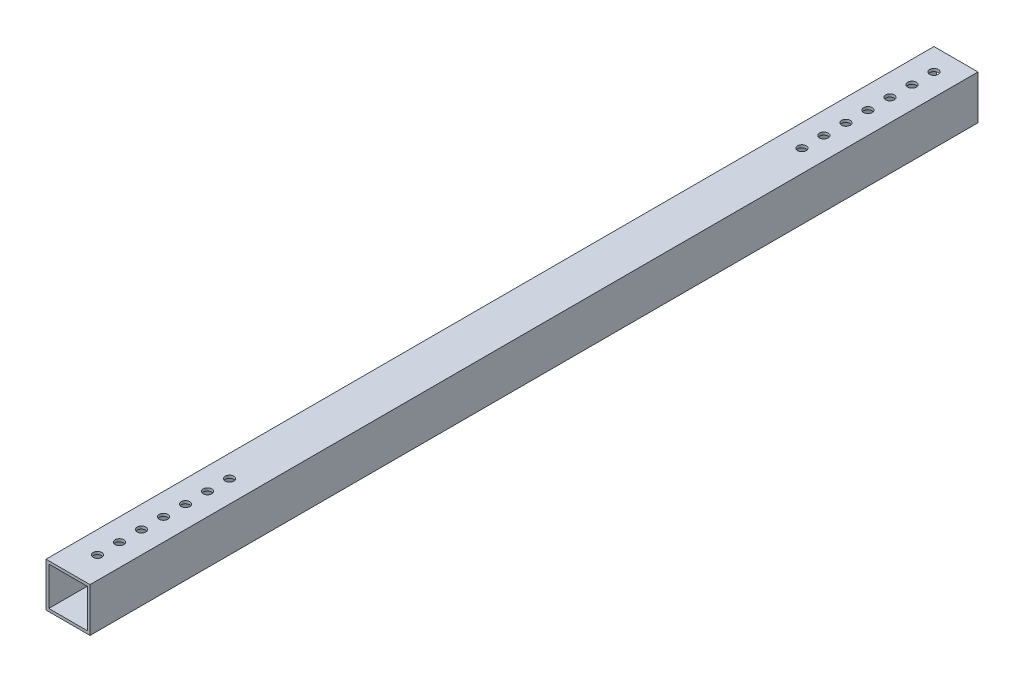
ISO-10303-21;
HEADER;
FILE_DESCRIPTION(('STEP AP214'),'2;1');
FILE_NAME('part.step','',(''),(''),'','','');
FILE_SCHEMA(('AUTOMOTIVE_DESIGN { 1 0 10303 214 1 1 1 1 }'));
ENDSEC;
DATA;
#1=APPLICATION_CONTEXT('core data for automotive mechanical design processes');
#2=APPLICATION_PROTOCOL_DEFINITION('international standard','automotive_design',2000,#1);
#3=PRODUCT_CONTEXT('',#1,'mechanical');
#4=PRODUCT('Part','Part','',(#3));
#5=PRODUCT_RELATED_PRODUCT_CATEGORY('part','',(#4));
#6=PRODUCT_DEFINITION_FORMATION('','',#4);
#7=PRODUCT_DEFINITION_CONTEXT('part definition',#1,'design');
#8=PRODUCT_DEFINITION('design','',#6,#7);
#9=PRODUCT_DEFINITION_SHAPE('','',#8);
#10=(LENGTH_UNIT() NAMED_UNIT(*) SI_UNIT(.MILLI.,.METRE.));
#11=(NAMED_UNIT(*) PLANE_ANGLE_UNIT() SI_UNIT($,.RADIAN.));
#12=(NAMED_UNIT(*) SI_UNIT($,.STERADIAN.) SOLID_ANGLE_UNIT());
#13=UNCERTAINTY_MEASURE_WITH_UNIT(LENGTH_MEASURE(1.E-05),#10,'distance_accuracy_value','');
#14=(GEOMETRIC_REPRESENTATION_CONTEXT(3) GLOBAL_UNCERTAINTY_ASSIGNED_CONTEXT((#13)) GLOBAL_UNIT_ASSIGNED_CONTEXT((#10,
#11,#12)) REPRESENTATION_CONTEXT('',''));
#15=CARTESIAN_POINT('',(0.,0.,0.));
#16=DIRECTION('',(0.,0.,1.));
#17=DIRECTION('',(1.,0.,0.));
#18=AXIS2_PLACEMENT_3D('',#15,#16,#17);
#19=CARTESIAN_POINT('',(0.,0.,256.145698528));
#20=DIRECTION('',(0.,0.,-1.));
#21=DIRECTION('',(-1.,0.,0.));
#22=AXIS2_PLACEMENT_3D('',#19,#20,#21);
#23=PLANE('',#22);
#24=DIRECTION('',(0.,1.,0.));
#25=VECTOR('',#24,1.);
#26=CARTESIAN_POINT('',(12.7,-12.7,256.145698528));
#27=LINE('',#26,#25);
#28=CARTESIAN_POINT('',(12.7,-12.7,256.145698528));
#29=VERTEX_POINT('',#28);
#30=CARTESIAN_POINT('',(12.7,12.7,256.145698528));
#31=VERTEX_POINT('',#30);
#32=EDGE_CURVE('E155',#29,#31,#27,.T.);
#33=ORIENTED_EDGE('',*,*,#32,.T.);
#34=DIRECTION('',(-1.,0.,0.));
#35=VECTOR('',#34,1.);
#36=CARTESIAN_POINT('',(-12.7,12.7,256.145698528));
#37=LINE('',#36,#35);
#38=CARTESIAN_POINT('',(-12.7,12.7,256.145698528));
#39=VERTEX_POINT('',#38);
#40=EDGE_CURVE('E159',#31,#39,#37,.T.);
#41=ORIENTED_EDGE('',*,*,#40,.T.);
#42=DIRECTION('',(0.,-1.,0.));
#43=VECTOR('',#42,1.);
#44=CARTESIAN_POINT('',(-12.7,-12.7,256.145698528));
#45=LINE('',#44,#43);
#46=CARTESIAN_POINT('',(-12.7,-12.7,256.145698528));
#47=VERTEX_POINT('',#46);
#48=EDGE_CURVE('E163',#39,#47,#45,.T.);
#49=ORIENTED_EDGE('',*,*,#48,.T.);
#50=DIRECTION('',(1.,0.,0.));
#51=VECTOR('',#50,1.);
#52=CARTESIAN_POINT('',(-12.7,-12.7,256.145698528));
#53=LINE('',#52,#51);
#54=EDGE_CURVE('E166',#47,#29,#53,.T.);
#55=ORIENTED_EDGE('',*,*,#54,.T.);
#56=EDGE_LOOP('',(#33,#41,#49,#55));
#57=FACE_BOUND('',#56,.T.);
#58=DIRECTION('',(0.,1.,0.));
#59=VECTOR('',#58,1.);
#60=CARTESIAN_POINT('',(11.1125,0.,256.145698528));
#61=LINE('',#60,#59);
#62=CARTESIAN_POINT('',(11.1125,-11.1125,256.145698528));
#63=VERTEX_POINT('',#62);
#64=CARTESIAN_POINT('',(11.1125,11.1125,256.145698528));
#65=VERTEX_POINT('',#64);
#66=EDGE_CURVE('E137',#63,#65,#61,.T.);
#67=ORIENTED_EDGE('',*,*,#66,.F.);
#68=DIRECTION('',(1.,0.,0.));
#69=VECTOR('',#68,1.);
#70=CARTESIAN_POINT('',(0.,-11.1125,256.145698528));
#71=LINE('',#70,#69);
#72=CARTESIAN_POINT('',(-11.1125,-11.1125,256.145698528));
#73=VERTEX_POINT('',#72);
#74=EDGE_CURVE('E118',#73,#63,#71,.T.);
#75=ORIENTED_EDGE('',*,*,#74,.F.);
#76=DIRECTION('',(0.,-1.,0.));
#77=VECTOR('',#76,1.);
#78=CARTESIAN_POINT('',(-11.1125,0.,256.145698528));
#79=LINE('',#78,#77);
#80=CARTESIAN_POINT('',(-11.1125,11.1125,256.145698528));
#81=VERTEX_POINT('',#80);
#82=EDGE_CURVE('E150',#81,#73,#79,.T.);
#83=ORIENTED_EDGE('',*,*,#82,.F.);
#84=DIRECTION('',(-1.,0.,0.));
#85=VECTOR('',#84,1.);
#86=CARTESIAN_POINT('',(0.,11.1125,256.145698528));
#87=LINE('',#86,#85);
#88=EDGE_CURVE('E141',#65,#81,#87,.T.);
#89=ORIENTED_EDGE('',*,*,#88,.F.);
#90=EDGE_LOOP('',(#67,#75,#83,#89));
#91=FACE_BOUND('',#90,.T.);
#92=ADVANCED_FACE('F45',(#57,#91),#23,.F.);
#93=CARTESIAN_POINT('',(0.,0.,-256.145698528));
#94=DIRECTION('',(0.,0.,-1.));
#95=DIRECTION('',(-1.,0.,0.));
#96=AXIS2_PLACEMENT_3D('',#93,#94,#95);
#97=PLANE('',#96);
#98=DIRECTION('',(0.,1.,0.));
#99=VECTOR('',#98,1.);
#100=CARTESIAN_POINT('',(12.7,-12.7,-256.145698528));
#101=LINE('',#100,#99);
#102=CARTESIAN_POINT('',(12.7,-12.7,-256.145698528));
#103=VERTEX_POINT('',#102);
#104=CARTESIAN_POINT('',(12.7,12.7,-256.145698528));
#105=VERTEX_POINT('',#104);
#106=EDGE_CURVE('E170',#103,#105,#101,.T.);
#107=ORIENTED_EDGE('',*,*,#106,.F.);
#108=DIRECTION('',(1.,0.,0.));
#109=VECTOR('',#108,1.);
#110=CARTESIAN_POINT('',(-12.7,-12.7,-256.145698528));
#111=LINE('',#110,#109);
#112=CARTESIAN_POINT('',(-12.7,-12.7,-256.145698528));
#113=VERTEX_POINT('',#112);
#114=EDGE_CURVE('E160',#113,#103,#111,.T.);
#115=ORIENTED_EDGE('',*,*,#114,.F.);
#116=DIRECTION('',(0.,-1.,0.));
#117=VECTOR('',#116,1.);
#118=CARTESIAN_POINT('',(-12.7,-12.7,-256.145698528));
#119=LINE('',#118,#117);
#120=CARTESIAN_POINT('',(-12.7,12.7,-256.145698528));
#121=VERTEX_POINT('',#120);
#122=EDGE_CURVE('E177',#121,#113,#119,.T.);
#123=ORIENTED_EDGE('',*,*,#122,.F.);
#124=DIRECTION('',(-1.,0.,0.));
#125=VECTOR('',#124,1.);
#126=CARTESIAN_POINT('',(-12.7,12.7,-256.145698528));
#127=LINE('',#126,#125);
#128=EDGE_CURVE('E174',#105,#121,#127,.T.);
#129=ORIENTED_EDGE('',*,*,#128,.F.);
#130=EDGE_LOOP('',(#107,#115,#123,#129));
#131=FACE_BOUND('',#130,.T.);
#132=DIRECTION('',(1.,0.,0.));
#133=VECTOR('',#132,1.);
#134=CARTESIAN_POINT('',(0.,-11.1125,-256.145698528));
#135=LINE('',#134,#133);
#136=CARTESIAN_POINT('',(-11.1125,-11.1125,-256.145698528));
#137=VERTEX_POINT('',#136);
#138=CARTESIAN_POINT('',(11.1125,-11.1125,-256.145698528));
#139=VERTEX_POINT('',#138);
#140=EDGE_CURVE('E116',#137,#139,#135,.T.);
#141=ORIENTED_EDGE('',*,*,#140,.T.);
#142=DIRECTION('',(0.,1.,0.));
#143=VECTOR('',#142,1.);
#144=CARTESIAN_POINT('',(11.1125,0.,-256.145698528));
#145=LINE('',#144,#143);
#146=CARTESIAN_POINT('',(11.1125,11.1125,-256.145698528));
#147=VERTEX_POINT('',#146);
#148=EDGE_CURVE('E125',#139,#147,#145,.T.);
#149=ORIENTED_EDGE('',*,*,#148,.T.);
#150=DIRECTION('',(-1.,0.,0.));
#151=VECTOR('',#150,1.);
#152=CARTESIAN_POINT('',(0.,11.1125,-256.145698528));
#153=LINE('',#152,#151);
#154=CARTESIAN_POINT('',(-11.1125,11.1125,-256.145698528));
#155=VERTEX_POINT('',#154);
#156=EDGE_CURVE('E132',#147,#155,#153,.T.);
#157=ORIENTED_EDGE('',*,*,#156,.T.);
#158=DIRECTION('',(0.,-1.,0.));
#159=VECTOR('',#158,1.);
#160=CARTESIAN_POINT('',(-11.1125,0.,-256.145698528));
#161=LINE('',#160,#159);
#162=EDGE_CURVE('E70',#155,#137,#161,.T.);
#163=ORIENTED_EDGE('',*,*,#162,.T.);
#164=EDGE_LOOP('',(#141,#149,#157,#163));
#165=FACE_BOUND('',#164,.T.);
#166=ADVANCED_FACE('F135',(#131,#165),#97,.T.);
#167=CARTESIAN_POINT('',(12.7,-12.7,256.145698528));
#168=DIRECTION('',(-1.,0.,0.));
#169=DIRECTION('',(0.,0.,1.));
#170=AXIS2_PLACEMENT_3D('',#167,#168,#169);
#171=PLANE('',#170);
#172=ORIENTED_EDGE('',*,*,#106,.T.);
#173=DIRECTION('',(0.,0.,-1.));
#174=VECTOR('',#173,1.);
#175=CARTESIAN_POINT('',(12.7,12.7,256.145698528));
#176=LINE('',#175,#174);
#177=EDGE_CURVE('E11',#31,#105,#176,.T.);
#178=ORIENTED_EDGE('',*,*,#177,.F.);
#179=ORIENTED_EDGE('',*,*,#32,.F.);
#180=DIRECTION('',(0.,0.,-1.));
#181=VECTOR('',#180,1.);
#182=CARTESIAN_POINT('',(12.7,-12.7,256.145698528));
#183=LINE('',#182,#181);
#184=EDGE_CURVE('E169',#29,#103,#183,.T.);
#185=ORIENTED_EDGE('',*,*,#184,.T.);
#186=EDGE_LOOP('',(#172,#178,#179,#185));
#187=FACE_BOUND('',#186,.T.);
#188=ADVANCED_FACE('F47',(#187),#171,.F.);
#189=CARTESIAN_POINT('',(-12.7,12.7,256.145698528));
#190=DIRECTION('',(0.,-1.,0.));
#191=DIRECTION('',(0.,0.,-1.));
#192=AXIS2_PLACEMENT_3D('',#189,#190,#191);
#193=PLANE('',#192);
#194=CARTESIAN_POINT('',(0.,12.7,-243.445698528));
#195=DIRECTION('',(0.,1.,0.));
#196=DIRECTION('',(0.,0.,1.));
#197=AXIS2_PLACEMENT_3D('',#194,#195,#196);
#198=CIRCLE('',#197,2.48920000000001);
#199=CARTESIAN_POINT('',(0.,12.7,-240.956498528));
#200=VERTEX_POINT('',#199);
#201=EDGE_CURVE('E322',#200,#200,#198,.T.);
#202=ORIENTED_EDGE('',*,*,#201,.F.);
#203=EDGE_LOOP('',(#202));
#204=FACE_BOUND('',#203,.T.);
#205=CARTESIAN_POINT('',(0.,12.7,-230.745698528));
#206=DIRECTION('',(0.,1.,0.));
#207=DIRECTION('',(0.,0.,1.));
#208=AXIS2_PLACEMENT_3D('',#205,#206,#207);
#209=CIRCLE('',#208,2.48920000000001);
#210=CARTESIAN_POINT('',(0.,12.7,-228.256498528));
#211=VERTEX_POINT('',#210);
#212=EDGE_CURVE('E326',#211,#211,#209,.T.);
#213=ORIENTED_EDGE('',*,*,#212,.F.);
#214=EDGE_LOOP('',(#213));
#215=FACE_BOUND('',#214,.T.);
#216=CARTESIAN_POINT('',(0.,12.7,-218.045698528));
#217=DIRECTION('',(0.,1.,0.));
#218=DIRECTION('',(0.,0.,1.));
#219=AXIS2_PLACEMENT_3D('',#216,#217,#218);
#220=CIRCLE('',#219,2.48920000000001);
#221=CARTESIAN_POINT('',(0.,12.7,-215.556498528));
#222=VERTEX_POINT('',#221);
#223=EDGE_CURVE('E330',#222,#222,#220,.T.);
#224=ORIENTED_EDGE('',*,*,#223,.F.);
#225=EDGE_LOOP('',(#224));
#226=FACE_BOUND('',#225,.T.);
#227=CARTESIAN_POINT('',(0.,12.7,-205.345698528));
#228=DIRECTION('',(0.,1.,0.));
#229=DIRECTION('',(0.,0.,1.));
#230=AXIS2_PLACEMENT_3D('',#227,#228,#229);
#231=CIRCLE('',#230,2.48920000000001);
#232=CARTESIAN_POINT('',(0.,12.7,-202.856498528));
#233=VERTEX_POINT('',#232);
#234=EDGE_CURVE('E334',#233,#233,#231,.T.);
#235=ORIENTED_EDGE('',*,*,#234,.F.);
#236=EDGE_LOOP('',(#235));
#237=FACE_BOUND('',#236,.T.);
#238=CARTESIAN_POINT('',(0.,12.7,-192.645698528));
#239=DIRECTION('',(0.,1.,0.));
#240=DIRECTION('',(0.,0.,1.));
#241=AXIS2_PLACEMENT_3D('',#238,#239,#240);
#242=CIRCLE('',#241,2.48920000000001);
#243=CARTESIAN_POINT('',(0.,12.7,-190.156498528));
#244=VERTEX_POINT('',#243);
#245=EDGE_CURVE('E338',#244,#244,#242,.T.);
#246=ORIENTED_EDGE('',*,*,#245,.F.);
#247=EDGE_LOOP('',(#246));
#248=FACE_BOUND('',#247,.T.);
#249=CARTESIAN_POINT('',(0.,12.7,-179.945698528));
#250=DIRECTION('',(0.,1.,0.));
#251=DIRECTION('',(0.,0.,1.));
#252=AXIS2_PLACEMENT_3D('',#249,#250,#251);
#253=CIRCLE('',#252,2.48920000000001);
#254=CARTESIAN_POINT('',(0.,12.7,-177.456498528));
#255=VERTEX_POINT('',#254);
#256=EDGE_CURVE('E342',#255,#255,#253,.T.);
#257=ORIENTED_EDGE('',*,*,#256,.F.);
#258=EDGE_LOOP('',(#257));
#259=FACE_BOUND('',#258,.T.);
#260=CARTESIAN_POINT('',(0.,12.7,-167.245698528));
#261=DIRECTION('',(0.,1.,0.));
#262=DIRECTION('',(0.,0.,1.));
#263=AXIS2_PLACEMENT_3D('',#260,#261,#262);
#264=CIRCLE('',#263,2.48920000000001);
#265=CARTESIAN_POINT('',(0.,12.7,-164.756498528));
#266=VERTEX_POINT('',#265);
#267=EDGE_CURVE('E346',#266,#266,#264,.T.);
#268=ORIENTED_EDGE('',*,*,#267,.F.);
#269=EDGE_LOOP('',(#268));
#270=FACE_BOUND('',#269,.T.);
#271=CARTESIAN_POINT('',(0.,12.7,162.954301472));
#272=DIRECTION('',(0.,1.,0.));
#273=DIRECTION('',(0.,0.,1.));
#274=AXIS2_PLACEMENT_3D('',#271,#272,#273);
#275=CIRCLE('',#274,2.48920000000001);
#276=CARTESIAN_POINT('',(0.,12.7,165.443501472));
#277=VERTEX_POINT('',#276);
#278=EDGE_CURVE('E350',#277,#277,#275,.T.);
#279=ORIENTED_EDGE('',*,*,#278,.F.);
#280=EDGE_LOOP('',(#279));
#281=FACE_BOUND('',#280,.T.);
#282=CARTESIAN_POINT('',(0.,12.7,175.654301472));
#283=DIRECTION('',(0.,1.,0.));
#284=DIRECTION('',(0.,0.,1.));
#285=AXIS2_PLACEMENT_3D('',#282,#283,#284);
#286=CIRCLE('',#285,2.48920000000001);
#287=CARTESIAN_POINT('',(0.,12.7,178.143501472));
#288=VERTEX_POINT('',#287);
#289=EDGE_CURVE('E354',#288,#288,#286,.T.);
#290=ORIENTED_EDGE('',*,*,#289,.F.);
#291=EDGE_LOOP('',(#290));
#292=FACE_BOUND('',#291,.T.);
#293=CARTESIAN_POINT('',(0.,12.7,188.354301472));
#294=DIRECTION('',(0.,1.,0.));
#295=DIRECTION('',(0.,0.,1.));
#296=AXIS2_PLACEMENT_3D('',#293,#294,#295);
#297=CIRCLE('',#296,2.48920000000001);
#298=CARTESIAN_POINT('',(0.,12.7,190.843501472));
#299=VERTEX_POINT('',#298);
#300=EDGE_CURVE('E358',#299,#299,#297,.T.);
#301=ORIENTED_EDGE('',*,*,#300,.F.);
#302=EDGE_LOOP('',(#301));
#303=FACE_BOUND('',#302,.T.);
#304=CARTESIAN_POINT('',(0.,12.7,201.054301472));
#305=DIRECTION('',(0.,1.,0.));
#306=DIRECTION('',(0.,0.,1.));
#307=AXIS2_PLACEMENT_3D('',#304,#305,#306);
#308=CIRCLE('',#307,2.48920000000001);
#309=CARTESIAN_POINT('',(0.,12.7,203.543501472));
#310=VERTEX_POINT('',#309);
#311=EDGE_CURVE('E362',#310,#310,#308,.T.);
#312=ORIENTED_EDGE('',*,*,#311,.F.);
#313=EDGE_LOOP('',(#312));
#314=FACE_BOUND('',#313,.T.);
#315=CARTESIAN_POINT('',(0.,12.7,213.754301472));
#316=DIRECTION('',(0.,1.,0.));
#317=DIRECTION('',(0.,0.,1.));
#318=AXIS2_PLACEMENT_3D('',#315,#316,#317);
#319=CIRCLE('',#318,2.48920000000001);
#320=CARTESIAN_POINT('',(0.,12.7,216.243501472));
#321=VERTEX_POINT('',#320);
#322=EDGE_CURVE('E366',#321,#321,#319,.T.);
#323=ORIENTED_EDGE('',*,*,#322,.F.);
#324=EDGE_LOOP('',(#323));
#325=FACE_BOUND('',#324,.T.);
#326=CARTESIAN_POINT('',(0.,12.7,226.454301472));
#327=DIRECTION('',(0.,1.,0.));
#328=DIRECTION('',(0.,0.,1.));
#329=AXIS2_PLACEMENT_3D('',#326,#327,#328);
#330=CIRCLE('',#329,2.48920000000001);
#331=CARTESIAN_POINT('',(0.,12.7,228.943501472));
#332=VERTEX_POINT('',#331);
#333=EDGE_CURVE('E370',#332,#332,#330,.T.);
#334=ORIENTED_EDGE('',*,*,#333,.F.);
#335=EDGE_LOOP('',(#334));
#336=FACE_BOUND('',#335,.T.);
#337=CARTESIAN_POINT('',(0.,12.7,239.154301472));
#338=DIRECTION('',(0.,1.,0.));
#339=DIRECTION('',(0.,0.,1.));
#340=AXIS2_PLACEMENT_3D('',#337,#338,#339);
#341=CIRCLE('',#340,2.48920000000001);
#342=CARTESIAN_POINT('',(0.,12.7,241.643501472));
#343=VERTEX_POINT('',#342);
#344=EDGE_CURVE('E374',#343,#343,#341,.T.);
#345=ORIENTED_EDGE('',*,*,#344,.F.);
#346=EDGE_LOOP('',(#345));
#347=FACE_BOUND('',#346,.T.);
#348=ORIENTED_EDGE('',*,*,#128,.T.);
#349=DIRECTION('',(0.,0.,-1.));
#350=VECTOR('',#349,1.);
#351=CARTESIAN_POINT('',(-12.7,12.7,256.145698528));
#352=LINE('',#351,#350);
#353=EDGE_CURVE('E55',#39,#121,#352,.T.);
#354=ORIENTED_EDGE('',*,*,#353,.F.);
#355=ORIENTED_EDGE('',*,*,#40,.F.);
#356=ORIENTED_EDGE('',*,*,#177,.T.);
#357=EDGE_LOOP('',(#348,#354,#355,#356));
#358=FACE_BOUND('',#357,.T.);
#359=ADVANCED_FACE('F311',(#204,#215,#226,#237,#248,#259,#270,#281,#292,#303,#314,#325,#336,
#347,#358),#193,.F.);
#360=CARTESIAN_POINT('',(-12.7,-12.7,256.145698528));
#361=DIRECTION('',(1.,0.,0.));
#362=DIRECTION('',(0.,0.,-1.));
#363=AXIS2_PLACEMENT_3D('',#360,#361,#362);
#364=PLANE('',#363);
#365=ORIENTED_EDGE('',*,*,#122,.T.);
#366=DIRECTION('',(0.,0.,-1.));
#367=VECTOR('',#366,1.);
#368=CARTESIAN_POINT('',(-12.7,-12.7,256.145698528));
#369=LINE('',#368,#367);
#370=EDGE_CURVE('E185',#47,#113,#369,.T.);
#371=ORIENTED_EDGE('',*,*,#370,.F.);
#372=ORIENTED_EDGE('',*,*,#48,.F.);
#373=ORIENTED_EDGE('',*,*,#353,.T.);
#374=EDGE_LOOP('',(#365,#371,#372,#373));
#375=FACE_BOUND('',#374,.T.);
#376=ADVANCED_FACE('F309',(#375),#364,.F.);
#377=CARTESIAN_POINT('',(-12.7,-12.7,256.145698528));
#378=DIRECTION('',(0.,1.,0.));
#379=DIRECTION('',(0.,0.,1.));
#380=AXIS2_PLACEMENT_3D('',#377,#378,#379);
#381=PLANE('',#380);
#382=CARTESIAN_POINT('',(0.,-12.7,-243.445698528));
#383=DIRECTION('',(0.,1.,0.));
#384=DIRECTION('',(0.,0.,1.));
#385=AXIS2_PLACEMENT_3D('',#382,#383,#384);
#386=CIRCLE('',#385,2.48920000000001);
#387=CARTESIAN_POINT('',(0.,-12.7,-240.956498528));
#388=VERTEX_POINT('',#387);
#389=EDGE_CURVE('E197',#388,#388,#386,.T.);
#390=ORIENTED_EDGE('',*,*,#389,.T.);
#391=EDGE_LOOP('',(#390));
#392=FACE_BOUND('',#391,.T.);
#393=CARTESIAN_POINT('',(0.,-12.7,-230.745698528));
#394=DIRECTION('',(0.,1.,0.));
#395=DIRECTION('',(0.,0.,1.));
#396=AXIS2_PLACEMENT_3D('',#393,#394,#395);
#397=CIRCLE('',#396,2.48920000000001);
#398=CARTESIAN_POINT('',(0.,-12.7,-228.256498528));
#399=VERTEX_POINT('',#398);
#400=EDGE_CURVE('E578',#399,#399,#397,.T.);
#401=ORIENTED_EDGE('',*,*,#400,.T.);
#402=EDGE_LOOP('',(#401));
#403=FACE_BOUND('',#402,.T.);
#404=CARTESIAN_POINT('',(0.,-12.7,-218.045698528));
#405=DIRECTION('',(0.,1.,0.));
#406=DIRECTION('',(0.,0.,1.));
#407=AXIS2_PLACEMENT_3D('',#404,#405,#406);
#408=CIRCLE('',#407,2.48920000000001);
#409=CARTESIAN_POINT('',(0.,-12.7,-215.556498528));
#410=VERTEX_POINT('',#409);
#411=EDGE_CURVE('E572',#410,#410,#408,.T.);
#412=ORIENTED_EDGE('',*,*,#411,.T.);
#413=EDGE_LOOP('',(#412));
#414=FACE_BOUND('',#413,.T.);
#415=CARTESIAN_POINT('',(0.,-12.7,-205.345698528));
#416=DIRECTION('',(0.,1.,0.));
#417=DIRECTION('',(0.,0.,1.));
#418=AXIS2_PLACEMENT_3D('',#415,#416,#417);
#419=CIRCLE('',#418,2.48920000000001);
#420=CARTESIAN_POINT('',(0.,-12.7,-202.856498528));
#421=VERTEX_POINT('',#420);
#422=EDGE_CURVE('E566',#421,#421,#419,.T.);
#423=ORIENTED_EDGE('',*,*,#422,.T.);
#424=EDGE_LOOP('',(#423));
#425=FACE_BOUND('',#424,.T.);
#426=CARTESIAN_POINT('',(0.,-12.7,-192.645698528));
#427=DIRECTION('',(0.,1.,0.));
#428=DIRECTION('',(0.,0.,1.));
#429=AXIS2_PLACEMENT_3D('',#426,#427,#428);
#430=CIRCLE('',#429,2.48920000000001);
#431=CARTESIAN_POINT('',(0.,-12.7,-190.156498528));
#432=VERTEX_POINT('',#431);
#433=EDGE_CURVE('E560',#432,#432,#430,.T.);
#434=ORIENTED_EDGE('',*,*,#433,.T.);
#435=EDGE_LOOP('',(#434));
#436=FACE_BOUND('',#435,.T.);
#437=CARTESIAN_POINT('',(0.,-12.7,-179.945698528));
#438=DIRECTION('',(0.,1.,0.));
#439=DIRECTION('',(0.,0.,1.));
#440=AXIS2_PLACEMENT_3D('',#437,#438,#439);
#441=CIRCLE('',#440,2.48920000000001);
#442=CARTESIAN_POINT('',(0.,-12.7,-177.456498528));
#443=VERTEX_POINT('',#442);
#444=EDGE_CURVE('E554',#443,#443,#441,.T.);
#445=ORIENTED_EDGE('',*,*,#444,.T.);
#446=EDGE_LOOP('',(#445));
#447=FACE_BOUND('',#446,.T.);
#448=CARTESIAN_POINT('',(0.,-12.7,-167.245698528));
#449=DIRECTION('',(0.,1.,0.));
#450=DIRECTION('',(0.,0.,1.));
#451=AXIS2_PLACEMENT_3D('',#448,#449,#450);
#452=CIRCLE('',#451,2.48920000000001);
#453=CARTESIAN_POINT('',(0.,-12.7,-164.756498528));
#454=VERTEX_POINT('',#453);
#455=EDGE_CURVE('E548',#454,#454,#452,.T.);
#456=ORIENTED_EDGE('',*,*,#455,.T.);
#457=EDGE_LOOP('',(#456));
#458=FACE_BOUND('',#457,.T.);
#459=CARTESIAN_POINT('',(0.,-12.7,162.954301472));
#460=DIRECTION('',(0.,1.,0.));
#461=DIRECTION('',(0.,0.,1.));
#462=AXIS2_PLACEMENT_3D('',#459,#460,#461);
#463=CIRCLE('',#462,2.48920000000001);
#464=CARTESIAN_POINT('',(0.,-12.7,165.443501472));
#465=VERTEX_POINT('',#464);
#466=EDGE_CURVE('E542',#465,#465,#463,.T.);
#467=ORIENTED_EDGE('',*,*,#466,.T.);
#468=EDGE_LOOP('',(#467));
#469=FACE_BOUND('',#468,.T.);
#470=CARTESIAN_POINT('',(0.,-12.7,175.654301472));
#471=DIRECTION('',(0.,1.,0.));
#472=DIRECTION('',(0.,0.,1.));
#473=AXIS2_PLACEMENT_3D('',#470,#471,#472);
#474=CIRCLE('',#473,2.48920000000001);
#475=CARTESIAN_POINT('',(0.,-12.7,178.143501472));
#476=VERTEX_POINT('',#475);
#477=EDGE_CURVE('E536',#476,#476,#474,.T.);
#478=ORIENTED_EDGE('',*,*,#477,.T.);
#479=EDGE_LOOP('',(#478));
#480=FACE_BOUND('',#479,.T.);
#481=CARTESIAN_POINT('',(0.,-12.7,188.354301472));
#482=DIRECTION('',(0.,1.,0.));
#483=DIRECTION('',(0.,0.,1.));
#484=AXIS2_PLACEMENT_3D('',#481,#482,#483);
#485=CIRCLE('',#484,2.48920000000001);
#486=CARTESIAN_POINT('',(0.,-12.7,190.843501472));
#487=VERTEX_POINT('',#486);
#488=EDGE_CURVE('E530',#487,#487,#485,.T.);
#489=ORIENTED_EDGE('',*,*,#488,.T.);
#490=EDGE_LOOP('',(#489));
#491=FACE_BOUND('',#490,.T.);
#492=CARTESIAN_POINT('',(0.,-12.7,201.054301472));
#493=DIRECTION('',(0.,1.,0.));
#494=DIRECTION('',(0.,0.,1.));
#495=AXIS2_PLACEMENT_3D('',#492,#493,#494);
#496=CIRCLE('',#495,2.48920000000001);
#497=CARTESIAN_POINT('',(0.,-12.7,203.543501472));
#498=VERTEX_POINT('',#497);
#499=EDGE_CURVE('E525',#498,#498,#496,.T.);
#500=ORIENTED_EDGE('',*,*,#499,.T.);
#501=EDGE_LOOP('',(#500));
#502=FACE_BOUND('',#501,.T.);
#503=CARTESIAN_POINT('',(0.,-12.7,213.754301472));
#504=DIRECTION('',(0.,1.,0.));
#505=DIRECTION('',(0.,0.,1.));
#506=AXIS2_PLACEMENT_3D('',#503,#504,#505);
#507=CIRCLE('',#506,2.48920000000001);
#508=CARTESIAN_POINT('',(0.,-12.7,216.243501472));
#509=VERTEX_POINT('',#508);
#510=EDGE_CURVE('E519',#509,#509,#507,.T.);
#511=ORIENTED_EDGE('',*,*,#510,.T.);
#512=EDGE_LOOP('',(#511));
#513=FACE_BOUND('',#512,.T.);
#514=CARTESIAN_POINT('',(0.,-12.7,226.454301472));
#515=DIRECTION('',(0.,1.,0.));
#516=DIRECTION('',(0.,0.,1.));
#517=AXIS2_PLACEMENT_3D('',#514,#515,#516);
#518=CIRCLE('',#517,2.48920000000001);
#519=CARTESIAN_POINT('',(0.,-12.7,228.943501472));
#520=VERTEX_POINT('',#519);
#521=EDGE_CURVE('E388',#520,#520,#518,.T.);
#522=ORIENTED_EDGE('',*,*,#521,.T.);
#523=EDGE_LOOP('',(#522));
#524=FACE_BOUND('',#523,.T.);
#525=CARTESIAN_POINT('',(0.,-12.7,239.154301472));
#526=DIRECTION('',(0.,1.,0.));
#527=DIRECTION('',(0.,0.,1.));
#528=AXIS2_PLACEMENT_3D('',#525,#526,#527);
#529=CIRCLE('',#528,2.48920000000001);
#530=CARTESIAN_POINT('',(0.,-12.7,241.643501472));
#531=VERTEX_POINT('',#530);
#532=EDGE_CURVE('E389',#531,#531,#529,.T.);
#533=ORIENTED_EDGE('',*,*,#532,.T.);
#534=EDGE_LOOP('',(#533));
#535=FACE_BOUND('',#534,.T.);
#536=ORIENTED_EDGE('',*,*,#114,.T.);
#537=ORIENTED_EDGE('',*,*,#184,.F.);
#538=ORIENTED_EDGE('',*,*,#54,.F.);
#539=ORIENTED_EDGE('',*,*,#370,.T.);
#540=EDGE_LOOP('',(#536,#537,#538,#539));
#541=FACE_BOUND('',#540,.T.);
#542=ADVANCED_FACE('F293',(#392,#403,#414,#425,#436,#447,#458,#469,#480,#491,#502,#513,#524,
#535,#541),#381,.F.);
#543=CARTESIAN_POINT('',(11.1125,-12.7,256.145698528));
#544=DIRECTION('',(-1.,0.,0.));
#545=DIRECTION('',(0.,0.,1.));
#546=AXIS2_PLACEMENT_3D('',#543,#544,#545);
#547=PLANE('',#546);
#548=ORIENTED_EDGE('',*,*,#148,.F.);
#549=DIRECTION('',(0.,0.,-1.));
#550=VECTOR('',#549,1.);
#551=CARTESIAN_POINT('',(11.1125,-11.1125,256.145698528));
#552=LINE('',#551,#550);
#553=EDGE_CURVE('E112',#63,#139,#552,.T.);
#554=ORIENTED_EDGE('',*,*,#553,.F.);
#555=ORIENTED_EDGE('',*,*,#66,.T.);
#556=DIRECTION('',(0.,0.,-1.));
#557=VECTOR('',#556,1.);
#558=CARTESIAN_POINT('',(11.1125,11.1125,256.145698528));
#559=LINE('',#558,#557);
#560=EDGE_CURVE('E128',#65,#147,#559,.T.);
#561=ORIENTED_EDGE('',*,*,#560,.T.);
#562=EDGE_LOOP('',(#548,#554,#555,#561));
#563=FACE_BOUND('',#562,.T.);
#564=ADVANCED_FACE('F126',(#563),#547,.T.);
#565=CARTESIAN_POINT('',(-12.7,11.1125,256.145698528));
#566=DIRECTION('',(0.,-1.,0.));
#567=DIRECTION('',(0.,0.,-1.));
#568=AXIS2_PLACEMENT_3D('',#565,#566,#567);
#569=PLANE('',#568);
#570=CARTESIAN_POINT('',(0.,11.1125,-243.445698528));
#571=DIRECTION('',(0.,-1.,0.));
#572=DIRECTION('',(0.,0.,-1.));
#573=AXIS2_PLACEMENT_3D('',#570,#571,#572);
#574=CIRCLE('',#573,2.48920000000001);
#575=CARTESIAN_POINT('',(0.,11.1125,-245.934898528));
#576=VERTEX_POINT('',#575);
#577=EDGE_CURVE('E133',#576,#576,#574,.T.);
#578=ORIENTED_EDGE('',*,*,#577,.F.);
#579=EDGE_LOOP('',(#578));
#580=FACE_BOUND('',#579,.T.);
#581=CARTESIAN_POINT('',(0.,11.1125,-230.745698528));
#582=DIRECTION('',(0.,-1.,0.));
#583=DIRECTION('',(0.,0.,-1.));
#584=AXIS2_PLACEMENT_3D('',#581,#582,#583);
#585=CIRCLE('',#584,2.48920000000001);
#586=CARTESIAN_POINT('',(0.,11.1125,-233.234898528));
#587=VERTEX_POINT('',#586);
#588=EDGE_CURVE('E255',#587,#587,#585,.T.);
#589=ORIENTED_EDGE('',*,*,#588,.F.);
#590=EDGE_LOOP('',(#589));
#591=FACE_BOUND('',#590,.T.);
#592=CARTESIAN_POINT('',(0.,11.1125,-218.045698528));
#593=DIRECTION('',(0.,-1.,0.));
#594=DIRECTION('',(0.,0.,-1.));
#595=AXIS2_PLACEMENT_3D('',#592,#593,#594);
#596=CIRCLE('',#595,2.48920000000001);
#597=CARTESIAN_POINT('',(0.,11.1125,-220.534898528));
#598=VERTEX_POINT('',#597);
#599=EDGE_CURVE('E251',#598,#598,#596,.T.);
#600=ORIENTED_EDGE('',*,*,#599,.F.);
#601=EDGE_LOOP('',(#600));
#602=FACE_BOUND('',#601,.T.);
#603=CARTESIAN_POINT('',(0.,11.1125,-205.345698528));
#604=DIRECTION('',(0.,-1.,0.));
#605=DIRECTION('',(0.,0.,-1.));
#606=AXIS2_PLACEMENT_3D('',#603,#604,#605);
#607=CIRCLE('',#606,2.48920000000001);
#608=CARTESIAN_POINT('',(0.,11.1125,-207.834898528));
#609=VERTEX_POINT('',#608);
#610=EDGE_CURVE('E247',#609,#609,#607,.T.);
#611=ORIENTED_EDGE('',*,*,#610,.F.);
#612=EDGE_LOOP('',(#611));
#613=FACE_BOUND('',#612,.T.);
#614=CARTESIAN_POINT('',(0.,11.1125,-192.645698528));
#615=DIRECTION('',(0.,-1.,0.));
#616=DIRECTION('',(0.,0.,-1.));
#617=AXIS2_PLACEMENT_3D('',#614,#615,#616);
#618=CIRCLE('',#617,2.48920000000001);
#619=CARTESIAN_POINT('',(0.,11.1125,-195.134898528));
#620=VERTEX_POINT('',#619);
#621=EDGE_CURVE('E242',#620,#620,#618,.T.);
#622=ORIENTED_EDGE('',*,*,#621,.F.);
#623=EDGE_LOOP('',(#622));
#624=FACE_BOUND('',#623,.T.);
#625=CARTESIAN_POINT('',(0.,11.1125,-179.945698528));
#626=DIRECTION('',(0.,-1.,0.));
#627=DIRECTION('',(0.,0.,-1.));
#628=AXIS2_PLACEMENT_3D('',#625,#626,#627);
#629=CIRCLE('',#628,2.48920000000001);
#630=CARTESIAN_POINT('',(0.,11.1125,-182.434898528));
#631=VERTEX_POINT('',#630);
#632=EDGE_CURVE('E237',#631,#631,#629,.T.);
#633=ORIENTED_EDGE('',*,*,#632,.F.);
#634=EDGE_LOOP('',(#633));
#635=FACE_BOUND('',#634,.T.);
#636=CARTESIAN_POINT('',(0.,11.1125,-167.245698528));
#637=DIRECTION('',(0.,-1.,0.));
#638=DIRECTION('',(0.,0.,-1.));
#639=AXIS2_PLACEMENT_3D('',#636,#637,#638);
#640=CIRCLE('',#639,2.48920000000001);
#641=CARTESIAN_POINT('',(0.,11.1125,-169.734898528));
#642=VERTEX_POINT('',#641);
#643=EDGE_CURVE('E232',#642,#642,#640,.T.);
#644=ORIENTED_EDGE('',*,*,#643,.F.);
#645=EDGE_LOOP('',(#644));
#646=FACE_BOUND('',#645,.T.);
#647=CARTESIAN_POINT('',(0.,11.1125,162.954301472));
#648=DIRECTION('',(0.,-1.,0.));
#649=DIRECTION('',(0.,0.,-1.));
#650=AXIS2_PLACEMENT_3D('',#647,#648,#649);
#651=CIRCLE('',#650,2.48920000000001);
#652=CARTESIAN_POINT('',(0.,11.1125,160.465101472));
#653=VERTEX_POINT('',#652);
#654=EDGE_CURVE('E227',#653,#653,#651,.T.);
#655=ORIENTED_EDGE('',*,*,#654,.F.);
#656=EDGE_LOOP('',(#655));
#657=FACE_BOUND('',#656,.T.);
#658=CARTESIAN_POINT('',(0.,11.1125,175.654301472));
#659=DIRECTION('',(0.,-1.,0.));
#660=DIRECTION('',(0.,0.,-1.));
#661=AXIS2_PLACEMENT_3D('',#658,#659,#660);
#662=CIRCLE('',#661,2.48920000000001);
#663=CARTESIAN_POINT('',(0.,11.1125,173.165101472));
#664=VERTEX_POINT('',#663);
#665=EDGE_CURVE('E222',#664,#664,#662,.T.);
#666=ORIENTED_EDGE('',*,*,#665,.F.);
#667=EDGE_LOOP('',(#666));
#668=FACE_BOUND('',#667,.T.);
#669=CARTESIAN_POINT('',(0.,11.1125,188.354301472));
#670=DIRECTION('',(0.,-1.,0.));
#671=DIRECTION('',(0.,0.,-1.));
#672=AXIS2_PLACEMENT_3D('',#669,#670,#671);
#673=CIRCLE('',#672,2.48920000000001);
#674=CARTESIAN_POINT('',(0.,11.1125,185.865101472));
#675=VERTEX_POINT('',#674);
#676=EDGE_CURVE('E217',#675,#675,#673,.T.);
#677=ORIENTED_EDGE('',*,*,#676,.F.);
#678=EDGE_LOOP('',(#677));
#679=FACE_BOUND('',#678,.T.);
#680=CARTESIAN_POINT('',(0.,11.1125,201.054301472));
#681=DIRECTION('',(0.,-1.,0.));
#682=DIRECTION('',(0.,0.,-1.));
#683=AXIS2_PLACEMENT_3D('',#680,#681,#682);
#684=CIRCLE('',#683,2.48920000000001);
#685=CARTESIAN_POINT('',(0.,11.1125,198.565101472));
#686=VERTEX_POINT('',#685);
#687=EDGE_CURVE('E212',#686,#686,#684,.T.);
#688=ORIENTED_EDGE('',*,*,#687,.F.);
#689=EDGE_LOOP('',(#688));
#690=FACE_BOUND('',#689,.T.);
#691=CARTESIAN_POINT('',(0.,11.1125,213.754301472));
#692=DIRECTION('',(0.,-1.,0.));
#693=DIRECTION('',(0.,0.,-1.));
#694=AXIS2_PLACEMENT_3D('',#691,#692,#693);
#695=CIRCLE('',#694,2.48920000000001);
#696=CARTESIAN_POINT('',(0.,11.1125,211.265101472));
#697=VERTEX_POINT('',#696);
#698=EDGE_CURVE('E207',#697,#697,#695,.T.);
#699=ORIENTED_EDGE('',*,*,#698,.F.);
#700=EDGE_LOOP('',(#699));
#701=FACE_BOUND('',#700,.T.);
#702=CARTESIAN_POINT('',(0.,11.1125,226.454301472));
#703=DIRECTION('',(0.,-1.,0.));
#704=DIRECTION('',(0.,0.,-1.));
#705=AXIS2_PLACEMENT_3D('',#702,#703,#704);
#706=CIRCLE('',#705,2.48920000000001);
#707=CARTESIAN_POINT('',(0.,11.1125,223.965101472));
#708=VERTEX_POINT('',#707);
#709=EDGE_CURVE('E202',#708,#708,#706,.T.);
#710=ORIENTED_EDGE('',*,*,#709,.F.);
#711=EDGE_LOOP('',(#710));
#712=FACE_BOUND('',#711,.T.);
#713=CARTESIAN_POINT('',(0.,11.1125,239.154301472));
#714=DIRECTION('',(0.,-1.,0.));
#715=DIRECTION('',(0.,0.,-1.));
#716=AXIS2_PLACEMENT_3D('',#713,#714,#715);
#717=CIRCLE('',#716,2.48920000000001);
#718=CARTESIAN_POINT('',(0.,11.1125,236.665101472));
#719=VERTEX_POINT('',#718);
#720=EDGE_CURVE('E196',#719,#719,#717,.T.);
#721=ORIENTED_EDGE('',*,*,#720,.F.);
#722=EDGE_LOOP('',(#721));
#723=FACE_BOUND('',#722,.T.);
#724=ORIENTED_EDGE('',*,*,#156,.F.);
#725=ORIENTED_EDGE('',*,*,#560,.F.);
#726=ORIENTED_EDGE('',*,*,#88,.T.);
#727=DIRECTION('',(0.,0.,-1.));
#728=VECTOR('',#727,1.);
#729=CARTESIAN_POINT('',(-11.1125,11.1125,256.145698528));
#730=LINE('',#729,#728);
#731=EDGE_CURVE('E273',#81,#155,#730,.T.);
#732=ORIENTED_EDGE('',*,*,#731,.T.);
#733=EDGE_LOOP('',(#724,#725,#726,#732));
#734=FACE_BOUND('',#733,.T.);
#735=ADVANCED_FACE('F282',(#580,#591,#602,#613,#624,#635,#646,#657,#668,#679,#690,#701,#712,
#723,#734),#569,.T.);
#736=CARTESIAN_POINT('',(-11.1125,-12.7,256.145698528));
#737=DIRECTION('',(1.,0.,0.));
#738=DIRECTION('',(0.,0.,-1.));
#739=AXIS2_PLACEMENT_3D('',#736,#737,#738);
#740=PLANE('',#739);
#741=ORIENTED_EDGE('',*,*,#162,.F.);
#742=ORIENTED_EDGE('',*,*,#731,.F.);
#743=ORIENTED_EDGE('',*,*,#82,.T.);
#744=DIRECTION('',(0.,0.,-1.));
#745=VECTOR('',#744,1.);
#746=CARTESIAN_POINT('',(-11.1125,-11.1125,256.145698528));
#747=LINE('',#746,#745);
#748=EDGE_CURVE('E63',#73,#137,#747,.T.);
#749=ORIENTED_EDGE('',*,*,#748,.T.);
#750=EDGE_LOOP('',(#741,#742,#743,#749));
#751=FACE_BOUND('',#750,.T.);
#752=ADVANCED_FACE('F277',(#751),#740,.T.);
#753=CARTESIAN_POINT('',(-12.7,-11.1125,256.145698528));
#754=DIRECTION('',(0.,1.,0.));
#755=DIRECTION('',(0.,0.,1.));
#756=AXIS2_PLACEMENT_3D('',#753,#754,#755);
#757=PLANE('',#756);
#758=CARTESIAN_POINT('',(0.,-11.1125,-243.445698528));
#759=DIRECTION('',(0.,1.,0.));
#760=DIRECTION('',(0.,0.,1.));
#761=AXIS2_PLACEMENT_3D('',#758,#759,#760);
#762=CIRCLE('',#761,2.48920000000001);
#763=CARTESIAN_POINT('',(0.,-11.1125,-240.956498528));
#764=VERTEX_POINT('',#763);
#765=EDGE_CURVE('E49',#764,#764,#762,.T.);
#766=ORIENTED_EDGE('',*,*,#765,.F.);
#767=EDGE_LOOP('',(#766));
#768=FACE_BOUND('',#767,.T.);
#769=CARTESIAN_POINT('',(0.,-11.1125,-230.745698528));
#770=DIRECTION('',(0.,1.,0.));
#771=DIRECTION('',(0.,0.,1.));
#772=AXIS2_PLACEMENT_3D('',#769,#770,#771);
#773=CIRCLE('',#772,2.48920000000001);
#774=CARTESIAN_POINT('',(0.,-11.1125,-228.256498528));
#775=VERTEX_POINT('',#774);
#776=EDGE_CURVE('E252',#775,#775,#773,.T.);
#777=ORIENTED_EDGE('',*,*,#776,.F.);
#778=EDGE_LOOP('',(#777));
#779=FACE_BOUND('',#778,.T.);
#780=CARTESIAN_POINT('',(0.,-11.1125,-218.045698528));
#781=DIRECTION('',(0.,1.,0.));
#782=DIRECTION('',(0.,0.,1.));
#783=AXIS2_PLACEMENT_3D('',#780,#781,#782);
#784=CIRCLE('',#783,2.48920000000001);
#785=CARTESIAN_POINT('',(0.,-11.1125,-215.556498528));
#786=VERTEX_POINT('',#785);
#787=EDGE_CURVE('E248',#786,#786,#784,.T.);
#788=ORIENTED_EDGE('',*,*,#787,.F.);
#789=EDGE_LOOP('',(#788));
#790=FACE_BOUND('',#789,.T.);
#791=CARTESIAN_POINT('',(0.,-11.1125,-205.345698528));
#792=DIRECTION('',(0.,1.,0.));
#793=DIRECTION('',(0.,0.,1.));
#794=AXIS2_PLACEMENT_3D('',#791,#792,#793);
#795=CIRCLE('',#794,2.48920000000001);
#796=CARTESIAN_POINT('',(0.,-11.1125,-202.856498528));
#797=VERTEX_POINT('',#796);
#798=EDGE_CURVE('E243',#797,#797,#795,.T.);
#799=ORIENTED_EDGE('',*,*,#798,.F.);
#800=EDGE_LOOP('',(#799));
#801=FACE_BOUND('',#800,.T.);
#802=CARTESIAN_POINT('',(0.,-11.1125,-192.645698528));
#803=DIRECTION('',(0.,1.,0.));
#804=DIRECTION('',(0.,0.,1.));
#805=AXIS2_PLACEMENT_3D('',#802,#803,#804);
#806=CIRCLE('',#805,2.48920000000001);
#807=CARTESIAN_POINT('',(0.,-11.1125,-190.156498528));
#808=VERTEX_POINT('',#807);
#809=EDGE_CURVE('E238',#808,#808,#806,.T.);
#810=ORIENTED_EDGE('',*,*,#809,.F.);
#811=EDGE_LOOP('',(#810));
#812=FACE_BOUND('',#811,.T.);
#813=CARTESIAN_POINT('',(0.,-11.1125,-179.945698528));
#814=DIRECTION('',(0.,1.,0.));
#815=DIRECTION('',(0.,0.,1.));
#816=AXIS2_PLACEMENT_3D('',#813,#814,#815);
#817=CIRCLE('',#816,2.48920000000001);
#818=CARTESIAN_POINT('',(0.,-11.1125,-177.456498528));
#819=VERTEX_POINT('',#818);
#820=EDGE_CURVE('E233',#819,#819,#817,.T.);
#821=ORIENTED_EDGE('',*,*,#820,.F.);
#822=EDGE_LOOP('',(#821));
#823=FACE_BOUND('',#822,.T.);
#824=CARTESIAN_POINT('',(0.,-11.1125,-167.245698528));
#825=DIRECTION('',(0.,1.,0.));
#826=DIRECTION('',(0.,0.,1.));
#827=AXIS2_PLACEMENT_3D('',#824,#825,#826);
#828=CIRCLE('',#827,2.48920000000001);
#829=CARTESIAN_POINT('',(0.,-11.1125,-164.756498528));
#830=VERTEX_POINT('',#829);
#831=EDGE_CURVE('E228',#830,#830,#828,.T.);
#832=ORIENTED_EDGE('',*,*,#831,.F.);
#833=EDGE_LOOP('',(#832));
#834=FACE_BOUND('',#833,.T.);
#835=CARTESIAN_POINT('',(0.,-11.1125,162.954301472));
#836=DIRECTION('',(0.,1.,0.));
#837=DIRECTION('',(0.,0.,1.));
#838=AXIS2_PLACEMENT_3D('',#835,#836,#837);
#839=CIRCLE('',#838,2.48920000000001);
#840=CARTESIAN_POINT('',(0.,-11.1125,165.443501472));
#841=VERTEX_POINT('',#840);
#842=EDGE_CURVE('E223',#841,#841,#839,.T.);
#843=ORIENTED_EDGE('',*,*,#842,.F.);
#844=EDGE_LOOP('',(#843));
#845=FACE_BOUND('',#844,.T.);
#846=CARTESIAN_POINT('',(0.,-11.1125,175.654301472));
#847=DIRECTION('',(0.,1.,0.));
#848=DIRECTION('',(0.,0.,1.));
#849=AXIS2_PLACEMENT_3D('',#846,#847,#848);
#850=CIRCLE('',#849,2.48920000000001);
#851=CARTESIAN_POINT('',(0.,-11.1125,178.143501472));
#852=VERTEX_POINT('',#851);
#853=EDGE_CURVE('E218',#852,#852,#850,.T.);
#854=ORIENTED_EDGE('',*,*,#853,.F.);
#855=EDGE_LOOP('',(#854));
#856=FACE_BOUND('',#855,.T.);
#857=CARTESIAN_POINT('',(0.,-11.1125,188.354301472));
#858=DIRECTION('',(0.,1.,0.));
#859=DIRECTION('',(0.,0.,1.));
#860=AXIS2_PLACEMENT_3D('',#857,#858,#859);
#861=CIRCLE('',#860,2.48920000000001);
#862=CARTESIAN_POINT('',(0.,-11.1125,190.843501472));
#863=VERTEX_POINT('',#862);
#864=EDGE_CURVE('E213',#863,#863,#861,.T.);
#865=ORIENTED_EDGE('',*,*,#864,.F.);
#866=EDGE_LOOP('',(#865));
#867=FACE_BOUND('',#866,.T.);
#868=CARTESIAN_POINT('',(0.,-11.1125,201.054301472));
#869=DIRECTION('',(0.,1.,0.));
#870=DIRECTION('',(0.,0.,1.));
#871=AXIS2_PLACEMENT_3D('',#868,#869,#870);
#872=CIRCLE('',#871,2.48920000000001);
#873=CARTESIAN_POINT('',(0.,-11.1125,203.543501472));
#874=VERTEX_POINT('',#873);
#875=EDGE_CURVE('E208',#874,#874,#872,.T.);
#876=ORIENTED_EDGE('',*,*,#875,.F.);
#877=EDGE_LOOP('',(#876));
#878=FACE_BOUND('',#877,.T.);
#879=CARTESIAN_POINT('',(0.,-11.1125,213.754301472));
#880=DIRECTION('',(0.,1.,0.));
#881=DIRECTION('',(0.,0.,1.));
#882=AXIS2_PLACEMENT_3D('',#879,#880,#881);
#883=CIRCLE('',#882,2.48920000000001);
#884=CARTESIAN_POINT('',(0.,-11.1125,216.243501472));
#885=VERTEX_POINT('',#884);
#886=EDGE_CURVE('E203',#885,#885,#883,.T.);
#887=ORIENTED_EDGE('',*,*,#886,.F.);
#888=EDGE_LOOP('',(#887));
#889=FACE_BOUND('',#888,.T.);
#890=CARTESIAN_POINT('',(0.,-11.1125,226.454301472));
#891=DIRECTION('',(0.,1.,0.));
#892=DIRECTION('',(0.,0.,1.));
#893=AXIS2_PLACEMENT_3D('',#890,#891,#892);
#894=CIRCLE('',#893,2.48920000000001);
#895=CARTESIAN_POINT('',(0.,-11.1125,228.943501472));
#896=VERTEX_POINT('',#895);
#897=EDGE_CURVE('E198',#896,#896,#894,.T.);
#898=ORIENTED_EDGE('',*,*,#897,.F.);
#899=EDGE_LOOP('',(#898));
#900=FACE_BOUND('',#899,.T.);
#901=CARTESIAN_POINT('',(0.,-11.1125,239.154301472));
#902=DIRECTION('',(0.,1.,0.));
#903=DIRECTION('',(0.,0.,1.));
#904=AXIS2_PLACEMENT_3D('',#901,#902,#903);
#905=CIRCLE('',#904,2.48920000000001);
#906=CARTESIAN_POINT('',(0.,-11.1125,241.643501472));
#907=VERTEX_POINT('',#906);
#908=EDGE_CURVE('E192',#907,#907,#905,.T.);
#909=ORIENTED_EDGE('',*,*,#908,.F.);
#910=EDGE_LOOP('',(#909));
#911=FACE_BOUND('',#910,.T.);
#912=ORIENTED_EDGE('',*,*,#140,.F.);
#913=ORIENTED_EDGE('',*,*,#748,.F.);
#914=ORIENTED_EDGE('',*,*,#74,.T.);
#915=ORIENTED_EDGE('',*,*,#553,.T.);
#916=EDGE_LOOP('',(#912,#913,#914,#915));
#917=FACE_BOUND('',#916,.T.);
#918=ADVANCED_FACE('F114',(#768,#779,#790,#801,#812,#823,#834,#845,#856,#867,#878,#889,#900,
#911,#917),#757,.T.);
#919=CARTESIAN_POINT('',(0.,-12.7,239.154301472));
#920=DIRECTION('',(0.,1.,0.));
#921=DIRECTION('',(0.,0.,1.));
#922=AXIS2_PLACEMENT_3D('',#919,#920,#921);
#923=CYLINDRICAL_SURFACE('',#922,2.48920000000001);
#924=ORIENTED_EDGE('',*,*,#908,.T.);
#925=EDGE_LOOP('',(#924));
#926=FACE_BOUND('',#925,.T.);
#927=ORIENTED_EDGE('',*,*,#532,.F.);
#928=EDGE_LOOP('',(#927));
#929=FACE_BOUND('',#928,.T.);
#930=ADVANCED_FACE('F456',(#926,#929),#923,.F.);
#931=CARTESIAN_POINT('',(0.,-12.7,226.454301472));
#932=DIRECTION('',(0.,1.,0.));
#933=DIRECTION('',(0.,0.,1.));
#934=AXIS2_PLACEMENT_3D('',#931,#932,#933);
#935=CYLINDRICAL_SURFACE('',#934,2.48920000000001);
#936=ORIENTED_EDGE('',*,*,#897,.T.);
#937=EDGE_LOOP('',(#936));
#938=FACE_BOUND('',#937,.T.);
#939=ORIENTED_EDGE('',*,*,#521,.F.);
#940=EDGE_LOOP('',(#939));
#941=FACE_BOUND('',#940,.T.);
#942=ADVANCED_FACE('F464',(#938,#941),#935,.F.);
#943=CARTESIAN_POINT('',(0.,-12.7,213.754301472));
#944=DIRECTION('',(0.,1.,0.));
#945=DIRECTION('',(0.,0.,1.));
#946=AXIS2_PLACEMENT_3D('',#943,#944,#945);
#947=CYLINDRICAL_SURFACE('',#946,2.48920000000001);
#948=ORIENTED_EDGE('',*,*,#886,.T.);
#949=EDGE_LOOP('',(#948));
#950=FACE_BOUND('',#949,.T.);
#951=ORIENTED_EDGE('',*,*,#510,.F.);
#952=EDGE_LOOP('',(#951));
#953=FACE_BOUND('',#952,.T.);
#954=ADVANCED_FACE('F474',(#950,#953),#947,.F.);
#955=CARTESIAN_POINT('',(0.,-12.7,201.054301472));
#956=DIRECTION('',(0.,1.,0.));
#957=DIRECTION('',(0.,0.,1.));
#958=AXIS2_PLACEMENT_3D('',#955,#956,#957);
#959=CYLINDRICAL_SURFACE('',#958,2.48920000000001);
#960=ORIENTED_EDGE('',*,*,#875,.T.);
#961=EDGE_LOOP('',(#960));
#962=FACE_BOUND('',#961,.T.);
#963=ORIENTED_EDGE('',*,*,#499,.F.);
#964=EDGE_LOOP('',(#963));
#965=FACE_BOUND('',#964,.T.);
#966=ADVANCED_FACE('F515',(#962,#965),#959,.F.);
#967=CARTESIAN_POINT('',(0.,-12.7,188.354301472));
#968=DIRECTION('',(0.,1.,0.));
#969=DIRECTION('',(0.,0.,1.));
#970=AXIS2_PLACEMENT_3D('',#967,#968,#969);
#971=CYLINDRICAL_SURFACE('',#970,2.48920000000001);
#972=ORIENTED_EDGE('',*,*,#864,.T.);
#973=EDGE_LOOP('',(#972));
#974=FACE_BOUND('',#973,.T.);
#975=ORIENTED_EDGE('',*,*,#488,.F.);
#976=EDGE_LOOP('',(#975));
#977=FACE_BOUND('',#976,.T.);
#978=ADVANCED_FACE('F634',(#974,#977),#971,.F.);
#979=CARTESIAN_POINT('',(0.,-12.7,175.654301472));
#980=DIRECTION('',(0.,1.,0.));
#981=DIRECTION('',(0.,0.,1.));
#982=AXIS2_PLACEMENT_3D('',#979,#980,#981);
#983=CYLINDRICAL_SURFACE('',#982,2.48920000000001);
#984=ORIENTED_EDGE('',*,*,#853,.T.);
#985=EDGE_LOOP('',(#984));
#986=FACE_BOUND('',#985,.T.);
#987=ORIENTED_EDGE('',*,*,#477,.F.);
#988=EDGE_LOOP('',(#987));
#989=FACE_BOUND('',#988,.T.);
#990=ADVANCED_FACE('F629',(#986,#989),#983,.F.);
#991=CARTESIAN_POINT('',(0.,-12.7,162.954301472));
#992=DIRECTION('',(0.,1.,0.));
#993=DIRECTION('',(0.,0.,1.));
#994=AXIS2_PLACEMENT_3D('',#991,#992,#993);
#995=CYLINDRICAL_SURFACE('',#994,2.48920000000001);
#996=ORIENTED_EDGE('',*,*,#842,.T.);
#997=EDGE_LOOP('',(#996));
#998=FACE_BOUND('',#997,.T.);
#999=ORIENTED_EDGE('',*,*,#466,.F.);
#1000=EDGE_LOOP('',(#999));
#1001=FACE_BOUND('',#1000,.T.);
#1002=ADVANCED_FACE('F624',(#998,#1001),#995,.F.);
#1003=CARTESIAN_POINT('',(0.,-12.7,-167.245698528));
#1004=DIRECTION('',(0.,1.,0.));
#1005=DIRECTION('',(0.,0.,1.));
#1006=AXIS2_PLACEMENT_3D('',#1003,#1004,#1005);
#1007=CYLINDRICAL_SURFACE('',#1006,2.48920000000001);
#1008=ORIENTED_EDGE('',*,*,#831,.T.);
#1009=EDGE_LOOP('',(#1008));
#1010=FACE_BOUND('',#1009,.T.);
#1011=ORIENTED_EDGE('',*,*,#455,.F.);
#1012=EDGE_LOOP('',(#1011));
#1013=FACE_BOUND('',#1012,.T.);
#1014=ADVANCED_FACE('F619',(#1010,#1013),#1007,.F.);
#1015=CARTESIAN_POINT('',(0.,-12.7,-179.945698528));
#1016=DIRECTION('',(0.,1.,0.));
#1017=DIRECTION('',(0.,0.,1.));
#1018=AXIS2_PLACEMENT_3D('',#1015,#1016,#1017);
#1019=CYLINDRICAL_SURFACE('',#1018,2.48920000000001);
#1020=ORIENTED_EDGE('',*,*,#820,.T.);
#1021=EDGE_LOOP('',(#1020));
#1022=FACE_BOUND('',#1021,.T.);
#1023=ORIENTED_EDGE('',*,*,#444,.F.);
#1024=EDGE_LOOP('',(#1023));
#1025=FACE_BOUND('',#1024,.T.);
#1026=ADVANCED_FACE('F615',(#1022,#1025),#1019,.F.);
#1027=CARTESIAN_POINT('',(0.,-12.7,-192.645698528));
#1028=DIRECTION('',(0.,1.,0.));
#1029=DIRECTION('',(0.,0.,1.));
#1030=AXIS2_PLACEMENT_3D('',#1027,#1028,#1029);
#1031=CYLINDRICAL_SURFACE('',#1030,2.48920000000001);
#1032=ORIENTED_EDGE('',*,*,#809,.T.);
#1033=EDGE_LOOP('',(#1032));
#1034=FACE_BOUND('',#1033,.T.);
#1035=ORIENTED_EDGE('',*,*,#433,.F.);
#1036=EDGE_LOOP('',(#1035));
#1037=FACE_BOUND('',#1036,.T.);
#1038=ADVANCED_FACE('F610',(#1034,#1037),#1031,.F.);
#1039=CARTESIAN_POINT('',(0.,-12.7,-205.345698528));
#1040=DIRECTION('',(0.,1.,0.));
#1041=DIRECTION('',(0.,0.,1.));
#1042=AXIS2_PLACEMENT_3D('',#1039,#1040,#1041);
#1043=CYLINDRICAL_SURFACE('',#1042,2.48920000000001);
#1044=ORIENTED_EDGE('',*,*,#798,.T.);
#1045=EDGE_LOOP('',(#1044));
#1046=FACE_BOUND('',#1045,.T.);
#1047=ORIENTED_EDGE('',*,*,#422,.F.);
#1048=EDGE_LOOP('',(#1047));
#1049=FACE_BOUND('',#1048,.T.);
#1050=ADVANCED_FACE('F606',(#1046,#1049),#1043,.F.);
#1051=CARTESIAN_POINT('',(0.,-12.7,-218.045698528));
#1052=DIRECTION('',(0.,1.,0.));
#1053=DIRECTION('',(0.,0.,1.));
#1054=AXIS2_PLACEMENT_3D('',#1051,#1052,#1053);
#1055=CYLINDRICAL_SURFACE('',#1054,2.48920000000001);
#1056=ORIENTED_EDGE('',*,*,#787,.T.);
#1057=EDGE_LOOP('',(#1056));
#1058=FACE_BOUND('',#1057,.T.);
#1059=ORIENTED_EDGE('',*,*,#411,.F.);
#1060=EDGE_LOOP('',(#1059));
#1061=FACE_BOUND('',#1060,.T.);
#1062=ADVANCED_FACE('F603',(#1058,#1061),#1055,.F.);
#1063=CARTESIAN_POINT('',(0.,-12.7,-230.745698528));
#1064=DIRECTION('',(0.,1.,0.));
#1065=DIRECTION('',(0.,0.,1.));
#1066=AXIS2_PLACEMENT_3D('',#1063,#1064,#1065);
#1067=CYLINDRICAL_SURFACE('',#1066,2.48920000000001);
#1068=ORIENTED_EDGE('',*,*,#776,.T.);
#1069=EDGE_LOOP('',(#1068));
#1070=FACE_BOUND('',#1069,.T.);
#1071=ORIENTED_EDGE('',*,*,#400,.F.);
#1072=EDGE_LOOP('',(#1071));
#1073=FACE_BOUND('',#1072,.T.);
#1074=ADVANCED_FACE('F465',(#1070,#1073),#1067,.F.);
#1075=CARTESIAN_POINT('',(0.,-12.7,-243.445698528));
#1076=DIRECTION('',(0.,1.,0.));
#1077=DIRECTION('',(0.,0.,1.));
#1078=AXIS2_PLACEMENT_3D('',#1075,#1076,#1077);
#1079=CYLINDRICAL_SURFACE('',#1078,2.48920000000001);
#1080=ORIENTED_EDGE('',*,*,#765,.T.);
#1081=EDGE_LOOP('',(#1080));
#1082=FACE_BOUND('',#1081,.T.);
#1083=ORIENTED_EDGE('',*,*,#389,.F.);
#1084=EDGE_LOOP('',(#1083));
#1085=FACE_BOUND('',#1084,.T.);
#1086=ADVANCED_FACE('F454',(#1082,#1085),#1079,.F.);
#1087=ORIENTED_EDGE('',*,*,#720,.T.);
#1088=EDGE_LOOP('',(#1087));
#1089=FACE_BOUND('',#1088,.T.);
#1090=ORIENTED_EDGE('',*,*,#344,.T.);
#1091=EDGE_LOOP('',(#1090));
#1092=FACE_BOUND('',#1091,.T.);
#1093=ADVANCED_FACE('F451',(#1089,#1092),#923,.F.);
#1094=ORIENTED_EDGE('',*,*,#709,.T.);
#1095=EDGE_LOOP('',(#1094));
#1096=FACE_BOUND('',#1095,.T.);
#1097=ORIENTED_EDGE('',*,*,#333,.T.);
#1098=EDGE_LOOP('',(#1097));
#1099=FACE_BOUND('',#1098,.T.);
#1100=ADVANCED_FACE('F453',(#1096,#1099),#935,.F.);
#1101=ORIENTED_EDGE('',*,*,#698,.T.);
#1102=EDGE_LOOP('',(#1101));
#1103=FACE_BOUND('',#1102,.T.);
#1104=ORIENTED_EDGE('',*,*,#322,.T.);
#1105=EDGE_LOOP('',(#1104));
#1106=FACE_BOUND('',#1105,.T.);
#1107=ADVANCED_FACE('F461',(#1103,#1106),#947,.F.);
#1108=ORIENTED_EDGE('',*,*,#687,.T.);
#1109=EDGE_LOOP('',(#1108));
#1110=FACE_BOUND('',#1109,.T.);
#1111=ORIENTED_EDGE('',*,*,#311,.T.);
#1112=EDGE_LOOP('',(#1111));
#1113=FACE_BOUND('',#1112,.T.);
#1114=ADVANCED_FACE('F643',(#1110,#1113),#959,.F.);
#1115=ORIENTED_EDGE('',*,*,#676,.T.);
#1116=EDGE_LOOP('',(#1115));
#1117=FACE_BOUND('',#1116,.T.);
#1118=ORIENTED_EDGE('',*,*,#300,.T.);
#1119=EDGE_LOOP('',(#1118));
#1120=FACE_BOUND('',#1119,.T.);
#1121=ADVANCED_FACE('F640',(#1117,#1120),#971,.F.);
#1122=ORIENTED_EDGE('',*,*,#665,.T.);
#1123=EDGE_LOOP('',(#1122));
#1124=FACE_BOUND('',#1123,.T.);
#1125=ORIENTED_EDGE('',*,*,#289,.T.);
#1126=EDGE_LOOP('',(#1125));
#1127=FACE_BOUND('',#1126,.T.);
#1128=ADVANCED_FACE('F636',(#1124,#1127),#983,.F.);
#1129=ORIENTED_EDGE('',*,*,#654,.T.);
#1130=EDGE_LOOP('',(#1129));
#1131=FACE_BOUND('',#1130,.T.);
#1132=ORIENTED_EDGE('',*,*,#278,.T.);
#1133=EDGE_LOOP('',(#1132));
#1134=FACE_BOUND('',#1133,.T.);
#1135=ADVANCED_FACE('F631',(#1131,#1134),#995,.F.);
#1136=ORIENTED_EDGE('',*,*,#643,.T.);
#1137=EDGE_LOOP('',(#1136));
#1138=FACE_BOUND('',#1137,.T.);
#1139=ORIENTED_EDGE('',*,*,#267,.T.);
#1140=EDGE_LOOP('',(#1139));
#1141=FACE_BOUND('',#1140,.T.);
#1142=ADVANCED_FACE('F626',(#1138,#1141),#1007,.F.);
#1143=ORIENTED_EDGE('',*,*,#632,.T.);
#1144=EDGE_LOOP('',(#1143));
#1145=FACE_BOUND('',#1144,.T.);
#1146=ORIENTED_EDGE('',*,*,#256,.T.);
#1147=EDGE_LOOP('',(#1146));
#1148=FACE_BOUND('',#1147,.T.);
#1149=ADVANCED_FACE('F621',(#1145,#1148),#1019,.F.);
#1150=ORIENTED_EDGE('',*,*,#621,.T.);
#1151=EDGE_LOOP('',(#1150));
#1152=FACE_BOUND('',#1151,.T.);
#1153=ORIENTED_EDGE('',*,*,#245,.T.);
#1154=EDGE_LOOP('',(#1153));
#1155=FACE_BOUND('',#1154,.T.);
#1156=ADVANCED_FACE('F429',(#1152,#1155),#1031,.F.);
#1157=ORIENTED_EDGE('',*,*,#610,.T.);
#1158=EDGE_LOOP('',(#1157));
#1159=FACE_BOUND('',#1158,.T.);
#1160=ORIENTED_EDGE('',*,*,#234,.T.);
#1161=EDGE_LOOP('',(#1160));
#1162=FACE_BOUND('',#1161,.T.);
#1163=ADVANCED_FACE('F612',(#1159,#1162),#1043,.F.);
#1164=ORIENTED_EDGE('',*,*,#599,.T.);
#1165=EDGE_LOOP('',(#1164));
#1166=FACE_BOUND('',#1165,.T.);
#1167=ORIENTED_EDGE('',*,*,#223,.T.);
#1168=EDGE_LOOP('',(#1167));
#1169=FACE_BOUND('',#1168,.T.);
#1170=ADVANCED_FACE('F598',(#1166,#1169),#1055,.F.);
#1171=ORIENTED_EDGE('',*,*,#588,.T.);
#1172=EDGE_LOOP('',(#1171));
#1173=FACE_BOUND('',#1172,.T.);
#1174=ORIENTED_EDGE('',*,*,#212,.T.);
#1175=EDGE_LOOP('',(#1174));
#1176=FACE_BOUND('',#1175,.T.);
#1177=ADVANCED_FACE('F593',(#1173,#1176),#1067,.F.);
#1178=ORIENTED_EDGE('',*,*,#577,.T.);
#1179=EDGE_LOOP('',(#1178));
#1180=FACE_BOUND('',#1179,.T.);
#1181=ORIENTED_EDGE('',*,*,#201,.T.);
#1182=EDGE_LOOP('',(#1181));
#1183=FACE_BOUND('',#1182,.T.);
#1184=ADVANCED_FACE('F468',(#1180,#1183),#1079,.F.);
#1185=CLOSED_SHELL('',(#92,#166,#188,#359,#376,#542,#564,#735,#752,#918,#930,#942,#954,#966,
#978,#990,#1002,#1014,#1026,#1038,#1050,#1062,#1074,#1086,#1093,#1100,#1107,#1114,#1121,#1128,
#1135,#1142,#1149,#1156,#1163,#1170,#1177,#1184));
#1186=MANIFOLD_SOLID_BREP('B2',#1185);
#1187=ADVANCED_BREP_SHAPE_REPRESENTATION('',(#18,#1186),#14);
#1188=SHAPE_DEFINITION_REPRESENTATION(#9,#1187);
ENDSEC;
END-ISO-10303-21;
